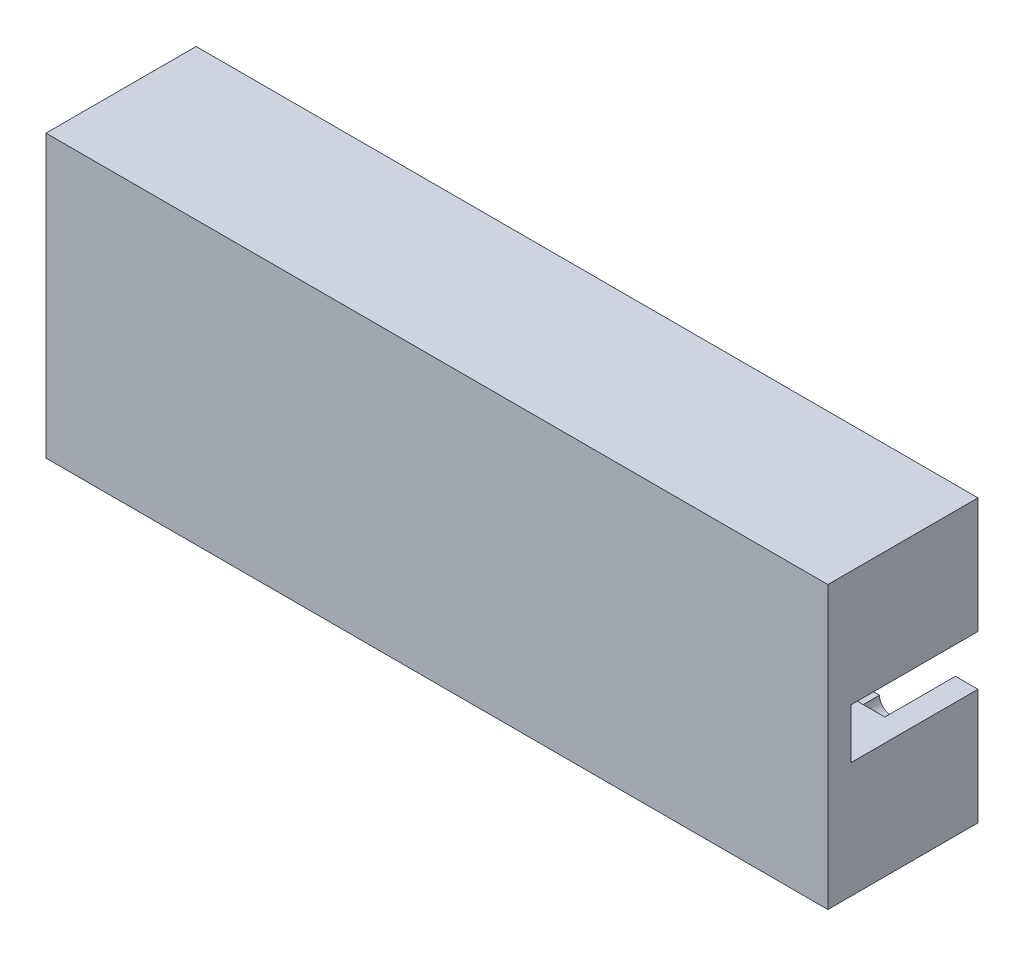
ISO-10303-21;
HEADER;
FILE_DESCRIPTION(('STEP AP214'),'2;1');
FILE_NAME('part.step','',(''),(''),'','','');
FILE_SCHEMA(('AUTOMOTIVE_DESIGN { 1 0 10303 214 1 1 1 1 }'));
ENDSEC;
DATA;
#1=APPLICATION_CONTEXT('core data for automotive mechanical design processes');
#2=APPLICATION_PROTOCOL_DEFINITION('international standard','automotive_design',2000,#1);
#3=PRODUCT_CONTEXT('',#1,'mechanical');
#4=PRODUCT('Part','Part','',(#3));
#5=PRODUCT_RELATED_PRODUCT_CATEGORY('part','',(#4));
#6=PRODUCT_DEFINITION_FORMATION('','',#4);
#7=PRODUCT_DEFINITION_CONTEXT('part definition',#1,'design');
#8=PRODUCT_DEFINITION('design','',#6,#7);
#9=PRODUCT_DEFINITION_SHAPE('','',#8);
#10=(LENGTH_UNIT() NAMED_UNIT(*) SI_UNIT(.MILLI.,.METRE.));
#11=(NAMED_UNIT(*) PLANE_ANGLE_UNIT() SI_UNIT($,.RADIAN.));
#12=(NAMED_UNIT(*) SI_UNIT($,.STERADIAN.) SOLID_ANGLE_UNIT());
#13=UNCERTAINTY_MEASURE_WITH_UNIT(LENGTH_MEASURE(1.E-05),#10,'distance_accuracy_value','');
#14=(GEOMETRIC_REPRESENTATION_CONTEXT(3) GLOBAL_UNCERTAINTY_ASSIGNED_CONTEXT((#13)) GLOBAL_UNIT_ASSIGNED_CONTEXT((#10,
#11,#12)) REPRESENTATION_CONTEXT('',''));
#15=CARTESIAN_POINT('',(0.,0.,0.));
#16=DIRECTION('',(0.,0.,1.));
#17=DIRECTION('',(1.,0.,0.));
#18=AXIS2_PLACEMENT_3D('',#15,#16,#17);
#19=CARTESIAN_POINT('',(64.135,16.1290000000001,29.591));
#20=DIRECTION('',(0.,1.,0.));
#21=DIRECTION('',(-1.,0.,0.));
#22=AXIS2_PLACEMENT_3D('',#19,#20,#21);
#23=PLANE('',#22);
#24=DIRECTION('',(-1.,0.,0.));
#25=VECTOR('',#24,1.);
#26=CARTESIAN_POINT('',(64.135,16.1290000000001,5.));
#27=LINE('',#26,#25);
#28=CARTESIAN_POINT('',(-19.9239542111493,16.1290000000002,5.));
#29=VERTEX_POINT('',#28);
#30=CARTESIAN_POINT('',(-43.5760457888507,16.1290000000002,5.));
#31=VERTEX_POINT('',#30);
#32=EDGE_CURVE('E223',#29,#31,#27,.T.);
#33=ORIENTED_EDGE('',*,*,#32,.F.);
#34=DIRECTION('',(0.,0.,-1.));
#35=VECTOR('',#34,1.);
#36=CARTESIAN_POINT('',(-19.9239542111492,16.1290000000002,5.));
#37=LINE('',#36,#35);
#38=CARTESIAN_POINT('',(-19.9239542111493,16.1290000000002,0.));
#39=VERTEX_POINT('',#38);
#40=EDGE_CURVE('E229',#29,#39,#37,.T.);
#41=ORIENTED_EDGE('',*,*,#40,.T.);
#42=DIRECTION('',(1.,0.,0.));
#43=VECTOR('',#42,1.);
#44=CARTESIAN_POINT('',(64.135,16.1290000000001,0.));
#45=LINE('',#44,#43);
#46=CARTESIAN_POINT('',(59.3725,16.1290000000001,0.));
#47=VERTEX_POINT('',#46);
#48=EDGE_CURVE('E369',#39,#47,#45,.T.);
#49=ORIENTED_EDGE('',*,*,#48,.T.);
#50=DIRECTION('',(0.,0.,-1.));
#51=VECTOR('',#50,1.);
#52=CARTESIAN_POINT('',(59.3725,16.1290000000001,66.9165787162104));
#53=LINE('',#52,#51);
#54=CARTESIAN_POINT('',(59.3725,16.1290000000001,29.591));
#55=VERTEX_POINT('',#54);
#56=EDGE_CURVE('E247',#55,#47,#53,.T.);
#57=ORIENTED_EDGE('',*,*,#56,.F.);
#58=DIRECTION('',(1.,0.,0.));
#59=VECTOR('',#58,1.);
#60=CARTESIAN_POINT('',(64.135,16.1290000000001,29.591));
#61=LINE('',#60,#59);
#62=CARTESIAN_POINT('',(-63.6905,16.1290000000001,29.591));
#63=VERTEX_POINT('',#62);
#64=EDGE_CURVE('E356',#63,#55,#61,.T.);
#65=ORIENTED_EDGE('',*,*,#64,.F.);
#66=DIRECTION('',(0.,0.,-1.));
#67=VECTOR('',#66,1.);
#68=CARTESIAN_POINT('',(-63.6905,16.1290000000001,66.9165787162104));
#69=LINE('',#68,#67);
#70=CARTESIAN_POINT('',(-63.6905,16.1290000000001,0.));
#71=VERTEX_POINT('',#70);
#72=EDGE_CURVE('E267',#63,#71,#69,.T.);
#73=ORIENTED_EDGE('',*,*,#72,.T.);
#74=CARTESIAN_POINT('',(-43.5760457888507,16.1290000000002,0.));
#75=VERTEX_POINT('',#74);
#76=EDGE_CURVE('E237',#71,#75,#45,.T.);
#77=ORIENTED_EDGE('',*,*,#76,.T.);
#78=DIRECTION('',(0.,0.,-1.));
#79=VECTOR('',#78,1.);
#80=CARTESIAN_POINT('',(-43.5760457888507,16.1290000000002,5.));
#81=LINE('',#80,#79);
#82=EDGE_CURVE('E66',#75,#31,#81,.F.);
#83=ORIENTED_EDGE('',*,*,#82,.T.);
#84=EDGE_LOOP('',(#33,#41,#49,#57,#65,#73,#77,#83));
#85=FACE_BOUND('',#84,.T.);
#86=ADVANCED_FACE('F43',(#85),#23,.F.);
#87=CARTESIAN_POINT('',(64.135,-16.1289999999999,29.591));
#88=DIRECTION('',(0.,-1.,0.));
#89=DIRECTION('',(0.,0.,-1.));
#90=AXIS2_PLACEMENT_3D('',#87,#88,#89);
#91=PLANE('',#90);
#92=DIRECTION('',(1.,0.,0.));
#93=VECTOR('',#92,1.);
#94=CARTESIAN_POINT('',(64.135,-16.1289999999999,5.));
#95=LINE('',#94,#93);
#96=CARTESIAN_POINT('',(-43.5760457888512,-16.1289999999999,5.));
#97=VERTEX_POINT('',#96);
#98=CARTESIAN_POINT('',(-19.9239542111488,-16.1289999999999,5.));
#99=VERTEX_POINT('',#98);
#100=EDGE_CURVE('E12',#97,#99,#95,.T.);
#101=ORIENTED_EDGE('',*,*,#100,.F.);
#102=DIRECTION('',(0.,0.,-1.));
#103=VECTOR('',#102,1.);
#104=CARTESIAN_POINT('',(-43.5760457888512,-16.1289999999999,5.));
#105=LINE('',#104,#103);
#106=CARTESIAN_POINT('',(-43.5760457888512,-16.1289999999999,0.));
#107=VERTEX_POINT('',#106);
#108=EDGE_CURVE('E238',#97,#107,#105,.T.);
#109=ORIENTED_EDGE('',*,*,#108,.T.);
#110=DIRECTION('',(-1.,0.,0.));
#111=VECTOR('',#110,1.);
#112=CARTESIAN_POINT('',(64.135,-16.1289999999999,0.));
#113=LINE('',#112,#111);
#114=CARTESIAN_POINT('',(-63.6905,-16.1290000000001,0.));
#115=VERTEX_POINT('',#114);
#116=EDGE_CURVE('E346',#107,#115,#113,.T.);
#117=ORIENTED_EDGE('',*,*,#116,.T.);
#118=DIRECTION('',(0.,0.,-1.));
#119=VECTOR('',#118,1.);
#120=CARTESIAN_POINT('',(-63.6905,-16.1290000000001,66.9165787162104));
#121=LINE('',#120,#119);
#122=CARTESIAN_POINT('',(-63.6905,-16.1289999999999,29.591));
#123=VERTEX_POINT('',#122);
#124=EDGE_CURVE('E270',#123,#115,#121,.T.);
#125=ORIENTED_EDGE('',*,*,#124,.F.);
#126=DIRECTION('',(-1.,0.,0.));
#127=VECTOR('',#126,1.);
#128=CARTESIAN_POINT('',(64.135,-16.1289999999999,29.591));
#129=LINE('',#128,#127);
#130=CARTESIAN_POINT('',(59.3725,-16.1290000000001,29.591));
#131=VERTEX_POINT('',#130);
#132=EDGE_CURVE('E350',#131,#123,#129,.T.);
#133=ORIENTED_EDGE('',*,*,#132,.F.);
#134=DIRECTION('',(0.,0.,-1.));
#135=VECTOR('',#134,1.);
#136=CARTESIAN_POINT('',(59.3725,-16.1290000000001,66.9165787162104));
#137=LINE('',#136,#135);
#138=CARTESIAN_POINT('',(59.3725,-16.1290000000001,0.));
#139=VERTEX_POINT('',#138);
#140=EDGE_CURVE('E253',#131,#139,#137,.T.);
#141=ORIENTED_EDGE('',*,*,#140,.T.);
#142=CARTESIAN_POINT('',(-19.9239542111488,-16.1289999999999,0.));
#143=VERTEX_POINT('',#142);
#144=EDGE_CURVE('E364',#139,#143,#113,.T.);
#145=ORIENTED_EDGE('',*,*,#144,.T.);
#146=DIRECTION('',(0.,0.,-1.));
#147=VECTOR('',#146,1.);
#148=CARTESIAN_POINT('',(-19.9239542111488,-16.1289999999999,5.));
#149=LINE('',#148,#147);
#150=EDGE_CURVE('E58',#143,#99,#149,.F.);
#151=ORIENTED_EDGE('',*,*,#150,.T.);
#152=EDGE_LOOP('',(#101,#109,#117,#125,#133,#141,#145,#151));
#153=FACE_BOUND('',#152,.T.);
#154=ADVANCED_FACE('F427',(#153),#91,.F.);
#155=CARTESIAN_POINT('',(0.,0.,14.351));
#156=DIRECTION('',(0.,0.,-1.));
#157=DIRECTION('',(-1.,0.,0.));
#158=AXIS2_PLACEMENT_3D('',#155,#156,#157);
#159=PLANE('',#158);
#160=DIRECTION('',(1.,0.,0.));
#161=VECTOR('',#160,1.);
#162=CARTESIAN_POINT('',(0.,5.07999999999999,14.351));
#163=LINE('',#162,#161);
#164=CARTESIAN_POINT('',(64.135,5.08,14.351));
#165=VERTEX_POINT('',#164);
#166=CARTESIAN_POINT('',(74.803,5.08,14.351));
#167=VERTEX_POINT('',#166);
#168=EDGE_CURVE('E308',#165,#167,#163,.T.);
#169=ORIENTED_EDGE('',*,*,#168,.F.);
#170=DIRECTION('',(0.,-1.,0.));
#171=VECTOR('',#170,1.);
#172=CARTESIAN_POINT('',(64.135,0.,14.351));
#173=LINE('',#172,#171);
#174=CARTESIAN_POINT('',(64.135,16.1290000000001,14.351));
#175=VERTEX_POINT('',#174);
#176=EDGE_CURVE('E332',#175,#165,#173,.T.);
#177=ORIENTED_EDGE('',*,*,#176,.F.);
#178=DIRECTION('',(-1.,0.,0.));
#179=VECTOR('',#178,1.);
#180=CARTESIAN_POINT('',(64.135,16.1290000000001,14.351));
#181=LINE('',#180,#179);
#182=CARTESIAN_POINT('',(72.42175,16.1290000000001,14.351));
#183=VERTEX_POINT('',#182);
#184=EDGE_CURVE('E335',#183,#175,#181,.T.);
#185=ORIENTED_EDGE('',*,*,#184,.F.);
#186=CARTESIAN_POINT('',(72.42175,13.7477500000001,14.351));
#187=DIRECTION('',(0.,0.,-1.));
#188=DIRECTION('',(-1.,0.,0.));
#189=AXIS2_PLACEMENT_3D('',#186,#187,#188);
#190=CIRCLE('',#189,2.38125);
#191=CARTESIAN_POINT('',(74.803,13.7477500000001,14.351));
#192=VERTEX_POINT('',#191);
#193=EDGE_CURVE('E406',#183,#192,#190,.T.);
#194=ORIENTED_EDGE('',*,*,#193,.T.);
#195=DIRECTION('',(0.,1.,0.));
#196=VECTOR('',#195,1.);
#197=CARTESIAN_POINT('',(74.803,16.1290000000001,14.351));
#198=LINE('',#197,#196);
#199=EDGE_CURVE('E327',#167,#192,#198,.T.);
#200=ORIENTED_EDGE('',*,*,#199,.F.);
#201=EDGE_LOOP('',(#169,#177,#185,#194,#200));
#202=FACE_BOUND('',#201,.T.);
#203=ADVANCED_FACE('F490',(#202),#159,.T.);
#204=CARTESIAN_POINT('',(79.375,-28.5749999999998,29.591));
#205=DIRECTION('',(-1.,0.,0.));
#206=DIRECTION('',(0.,0.,1.));
#207=AXIS2_PLACEMENT_3D('',#204,#205,#206);
#208=PLANE('',#207);
#209=DIRECTION('',(0.,1.,0.));
#210=VECTOR('',#209,1.);
#211=CARTESIAN_POINT('',(79.375,-5.08,25.781));
#212=LINE('',#211,#210);
#213=CARTESIAN_POINT('',(79.375,-5.08,25.781));
#214=VERTEX_POINT('',#213);
#215=CARTESIAN_POINT('',(79.375,5.08,25.781));
#216=VERTEX_POINT('',#215);
#217=EDGE_CURVE('E297',#214,#216,#212,.T.);
#218=ORIENTED_EDGE('',*,*,#217,.T.);
#219=DIRECTION('',(0.,0.,-1.));
#220=VECTOR('',#219,1.);
#221=CARTESIAN_POINT('',(79.375,5.08,29.591));
#222=LINE('',#221,#220);
#223=CARTESIAN_POINT('',(79.375,5.08,0.));
#224=VERTEX_POINT('',#223);
#225=EDGE_CURVE('E343',#216,#224,#222,.T.);
#226=ORIENTED_EDGE('',*,*,#225,.T.);
#227=DIRECTION('',(0.,1.,0.));
#228=VECTOR('',#227,1.);
#229=CARTESIAN_POINT('',(79.375,-28.5749999999998,0.));
#230=LINE('',#229,#228);
#231=CARTESIAN_POINT('',(79.375,28.5750000000002,0.));
#232=VERTEX_POINT('',#231);
#233=EDGE_CURVE('E373',#224,#232,#230,.T.);
#234=ORIENTED_EDGE('',*,*,#233,.T.);
#235=DIRECTION('',(0.,0.,-1.));
#236=VECTOR('',#235,1.);
#237=CARTESIAN_POINT('',(79.375,28.5750000000002,29.591));
#238=LINE('',#237,#236);
#239=CARTESIAN_POINT('',(79.375,28.575,30.48));
#240=VERTEX_POINT('',#239);
#241=EDGE_CURVE('E398',#240,#232,#238,.T.);
#242=ORIENTED_EDGE('',*,*,#241,.F.);
#243=DIRECTION('',(0.,1.,0.));
#244=VECTOR('',#243,1.);
#245=CARTESIAN_POINT('',(79.375,28.575,30.48));
#246=LINE('',#245,#244);
#247=CARTESIAN_POINT('',(79.375,-28.575,30.48));
#248=VERTEX_POINT('',#247);
#249=EDGE_CURVE('E284',#248,#240,#246,.T.);
#250=ORIENTED_EDGE('',*,*,#249,.F.);
#251=DIRECTION('',(0.,0.,-1.));
#252=VECTOR('',#251,1.);
#253=CARTESIAN_POINT('',(79.375,-28.5749999999998,29.591));
#254=LINE('',#253,#252);
#255=CARTESIAN_POINT('',(79.375,-28.5749999999998,0.));
#256=VERTEX_POINT('',#255);
#257=EDGE_CURVE('E389',#248,#256,#254,.T.);
#258=ORIENTED_EDGE('',*,*,#257,.T.);
#259=CARTESIAN_POINT('',(79.375,-5.08,0.));
#260=VERTEX_POINT('',#259);
#261=EDGE_CURVE('E380',#256,#260,#230,.T.);
#262=ORIENTED_EDGE('',*,*,#261,.T.);
#263=DIRECTION('',(0.,0.,-1.));
#264=VECTOR('',#263,1.);
#265=CARTESIAN_POINT('',(79.375,-5.08,29.591));
#266=LINE('',#265,#264);
#267=EDGE_CURVE('E318',#214,#260,#266,.T.);
#268=ORIENTED_EDGE('',*,*,#267,.F.);
#269=EDGE_LOOP('',(#218,#226,#234,#242,#250,#258,#262,#268));
#270=FACE_BOUND('',#269,.T.);
#271=ADVANCED_FACE('F458',(#270),#208,.F.);
#272=CARTESIAN_POINT('',(0.,0.,0.));
#273=DIRECTION('',(0.,0.,-1.));
#274=DIRECTION('',(-1.,0.,0.));
#275=AXIS2_PLACEMENT_3D('',#272,#273,#274);
#276=PLANE('',#275);
#277=CARTESIAN_POINT('',(-31.75,0.,0.));
#278=DIRECTION('',(0.,0.,-1.));
#279=DIRECTION('',(-1.,0.,0.));
#280=AXIS2_PLACEMENT_3D('',#277,#278,#279);
#281=CIRCLE('',#280,20.);
#282=EDGE_CURVE('E508',#75,#39,#281,.T.);
#283=ORIENTED_EDGE('',*,*,#282,.F.);
#284=ORIENTED_EDGE('',*,*,#76,.F.);
#285=CARTESIAN_POINT('',(-66.07175,16.1290000000001,0.));
#286=DIRECTION('',(0.,0.,-1.));
#287=DIRECTION('',(1.,0.,0.));
#288=AXIS2_PLACEMENT_3D('',#285,#286,#287);
#289=CIRCLE('',#288,2.38124999999999);
#290=CARTESIAN_POINT('',(-68.453,16.1290000000001,0.));
#291=VERTEX_POINT('',#290);
#292=EDGE_CURVE('E275',#291,#71,#289,.T.);
#293=ORIENTED_EDGE('',*,*,#292,.F.);
#294=DIRECTION('',(0.,1.,0.));
#295=VECTOR('',#294,1.);
#296=CARTESIAN_POINT('',(-68.453,-16.1289999999999,0.));
#297=LINE('',#296,#295);
#298=CARTESIAN_POINT('',(-68.453,-16.1290000000001,0.));
#299=VERTEX_POINT('',#298);
#300=EDGE_CURVE('E363',#299,#291,#297,.T.);
#301=ORIENTED_EDGE('',*,*,#300,.F.);
#302=CARTESIAN_POINT('',(-66.07175,-16.1290000000001,0.));
#303=DIRECTION('',(0.,0.,-1.));
#304=DIRECTION('',(1.,0.,0.));
#305=AXIS2_PLACEMENT_3D('',#302,#303,#304);
#306=CIRCLE('',#305,2.38124999999999);
#307=EDGE_CURVE('E250',#115,#299,#306,.T.);
#308=ORIENTED_EDGE('',*,*,#307,.F.);
#309=ORIENTED_EDGE('',*,*,#116,.F.);
#310=CARTESIAN_POINT('',(-31.75,0.,0.));
#311=DIRECTION('',(0.,0.,-1.));
#312=DIRECTION('',(-1.,0.,0.));
#313=AXIS2_PLACEMENT_3D('',#310,#311,#312);
#314=CIRCLE('',#313,20.);
#315=EDGE_CURVE('E51',#143,#107,#314,.T.);
#316=ORIENTED_EDGE('',*,*,#315,.F.);
#317=ORIENTED_EDGE('',*,*,#144,.F.);
#318=CARTESIAN_POINT('',(61.75375,-16.1290000000001,0.));
#319=DIRECTION('',(0.,0.,-1.));
#320=DIRECTION('',(-1.,0.,0.));
#321=AXIS2_PLACEMENT_3D('',#318,#319,#320);
#322=CIRCLE('',#321,2.38124999999999);
#323=CARTESIAN_POINT('',(64.135,-16.1290000000001,0.));
#324=VERTEX_POINT('',#323);
#325=EDGE_CURVE('E248',#324,#139,#322,.T.);
#326=ORIENTED_EDGE('',*,*,#325,.F.);
#327=CARTESIAN_POINT('',(72.42175,-16.1289999999999,0.));
#328=VERTEX_POINT('',#327);
#329=EDGE_CURVE('E360',#328,#324,#113,.T.);
#330=ORIENTED_EDGE('',*,*,#329,.F.);
#331=CARTESIAN_POINT('',(72.42175,-13.7477499999999,0.));
#332=DIRECTION('',(0.,0.,-1.));
#333=DIRECTION('',(-1.,0.,0.));
#334=AXIS2_PLACEMENT_3D('',#331,#332,#333);
#335=CIRCLE('',#334,2.38125);
#336=CARTESIAN_POINT('',(74.803,-13.7477499999999,0.));
#337=VERTEX_POINT('',#336);
#338=EDGE_CURVE('E415',#328,#337,#335,.F.);
#339=ORIENTED_EDGE('',*,*,#338,.T.);
#340=DIRECTION('',(0.,1.,0.));
#341=VECTOR('',#340,1.);
#342=CARTESIAN_POINT('',(74.803,-16.1290000000001,0.));
#343=LINE('',#342,#341);
#344=CARTESIAN_POINT('',(74.803,-5.08,0.));
#345=VERTEX_POINT('',#344);
#346=EDGE_CURVE('E321',#337,#345,#343,.T.);
#347=ORIENTED_EDGE('',*,*,#346,.T.);
#348=DIRECTION('',(1.,0.,0.));
#349=VECTOR('',#348,1.);
#350=CARTESIAN_POINT('',(74.803,-5.08,0.));
#351=LINE('',#350,#349);
#352=EDGE_CURVE('E310',#345,#260,#351,.T.);
#353=ORIENTED_EDGE('',*,*,#352,.T.);
#354=ORIENTED_EDGE('',*,*,#261,.F.);
#355=DIRECTION('',(1.,0.,0.));
#356=VECTOR('',#355,1.);
#357=CARTESIAN_POINT('',(-79.375,-28.5749999999998,0.));
#358=LINE('',#357,#356);
#359=CARTESIAN_POINT('',(-79.375,-28.5749999999998,0.));
#360=VERTEX_POINT('',#359);
#361=EDGE_CURVE('E387',#360,#256,#358,.T.);
#362=ORIENTED_EDGE('',*,*,#361,.F.);
#363=DIRECTION('',(0.,-1.,0.));
#364=VECTOR('',#363,1.);
#365=CARTESIAN_POINT('',(-79.375,-28.5749999999998,0.));
#366=LINE('',#365,#364);
#367=CARTESIAN_POINT('',(-79.375,28.5750000000002,0.));
#368=VERTEX_POINT('',#367);
#369=EDGE_CURVE('E385',#368,#360,#366,.T.);
#370=ORIENTED_EDGE('',*,*,#369,.F.);
#371=DIRECTION('',(-1.,0.,0.));
#372=VECTOR('',#371,1.);
#373=CARTESIAN_POINT('',(-79.375,28.5750000000002,0.));
#374=LINE('',#373,#372);
#375=EDGE_CURVE('E383',#232,#368,#374,.T.);
#376=ORIENTED_EDGE('',*,*,#375,.F.);
#377=ORIENTED_EDGE('',*,*,#233,.F.);
#378=DIRECTION('',(1.,0.,0.));
#379=VECTOR('',#378,1.);
#380=CARTESIAN_POINT('',(74.803,5.08,0.));
#381=LINE('',#380,#379);
#382=CARTESIAN_POINT('',(74.803,5.08,0.));
#383=VERTEX_POINT('',#382);
#384=EDGE_CURVE('E337',#383,#224,#381,.T.);
#385=ORIENTED_EDGE('',*,*,#384,.F.);
#386=DIRECTION('',(0.,-1.,0.));
#387=VECTOR('',#386,1.);
#388=CARTESIAN_POINT('',(74.803,16.1290000000001,0.));
#389=LINE('',#388,#387);
#390=CARTESIAN_POINT('',(74.803,13.7477500000001,0.));
#391=VERTEX_POINT('',#390);
#392=EDGE_CURVE('E326',#391,#383,#389,.T.);
#393=ORIENTED_EDGE('',*,*,#392,.F.);
#394=CARTESIAN_POINT('',(72.42175,13.7477500000001,0.));
#395=DIRECTION('',(0.,0.,-1.));
#396=DIRECTION('',(-1.,0.,0.));
#397=AXIS2_PLACEMENT_3D('',#394,#395,#396);
#398=CIRCLE('',#397,2.38125);
#399=CARTESIAN_POINT('',(72.42175,16.1290000000001,0.));
#400=VERTEX_POINT('',#399);
#401=EDGE_CURVE('E417',#391,#400,#398,.F.);
#402=ORIENTED_EDGE('',*,*,#401,.T.);
#403=CARTESIAN_POINT('',(64.135,16.1290000000001,0.));
#404=VERTEX_POINT('',#403);
#405=EDGE_CURVE('E367',#404,#400,#45,.T.);
#406=ORIENTED_EDGE('',*,*,#405,.F.);
#407=CARTESIAN_POINT('',(61.75375,16.1290000000001,0.));
#408=DIRECTION('',(0.,0.,-1.));
#409=DIRECTION('',(-1.,0.,0.));
#410=AXIS2_PLACEMENT_3D('',#407,#408,#409);
#411=CIRCLE('',#410,2.38124999999999);
#412=EDGE_CURVE('E245',#47,#404,#411,.T.);
#413=ORIENTED_EDGE('',*,*,#412,.F.);
#414=ORIENTED_EDGE('',*,*,#48,.F.);
#415=EDGE_LOOP('',(#283,#284,#293,#301,#308,#309,#316,#317,#326,#330,#339,#347,#353,#354,#362,
#370,#376,#377,#385,#393,#402,#406,#413,#414));
#416=FACE_BOUND('',#415,.T.);
#417=ADVANCED_FACE('F430',(#416),#276,.T.);
#418=CARTESIAN_POINT('',(64.135,-16.1289999999999,29.591));
#419=DIRECTION('',(1.,0.,0.));
#420=DIRECTION('',(0.,0.,-1.));
#421=AXIS2_PLACEMENT_3D('',#418,#419,#420);
#422=PLANE('',#421);
#423=ORIENTED_EDGE('',*,*,#176,.T.);
#424=DIRECTION('',(0.,0.,-1.));
#425=VECTOR('',#424,1.);
#426=CARTESIAN_POINT('',(64.135,5.08,47.9072004793571));
#427=LINE('',#426,#425);
#428=CARTESIAN_POINT('',(64.135,5.08,25.781));
#429=VERTEX_POINT('',#428);
#430=EDGE_CURVE('E295',#429,#165,#427,.T.);
#431=ORIENTED_EDGE('',*,*,#430,.F.);
#432=DIRECTION('',(0.,-1.,0.));
#433=VECTOR('',#432,1.);
#434=CARTESIAN_POINT('',(64.135,-5.08,25.781));
#435=LINE('',#434,#433);
#436=CARTESIAN_POINT('',(64.135,-5.08,25.781));
#437=VERTEX_POINT('',#436);
#438=EDGE_CURVE('E291',#429,#437,#435,.T.);
#439=ORIENTED_EDGE('',*,*,#438,.T.);
#440=DIRECTION('',(0.,0.,-1.));
#441=VECTOR('',#440,1.);
#442=CARTESIAN_POINT('',(64.135,-5.08,47.9072004793571));
#443=LINE('',#442,#441);
#444=CARTESIAN_POINT('',(64.135,-5.08,14.351));
#445=VERTEX_POINT('',#444);
#446=EDGE_CURVE('E290',#437,#445,#443,.T.);
#447=ORIENTED_EDGE('',*,*,#446,.T.);
#448=CARTESIAN_POINT('',(64.135,-16.1290000000001,14.351));
#449=VERTEX_POINT('',#448);
#450=EDGE_CURVE('E330',#445,#449,#173,.T.);
#451=ORIENTED_EDGE('',*,*,#450,.T.);
#452=DIRECTION('',(0.,0.,-1.));
#453=VECTOR('',#452,1.);
#454=CARTESIAN_POINT('',(64.135,-16.1289999999999,29.591));
#455=LINE('',#454,#453);
#456=CARTESIAN_POINT('',(64.135,-16.1289999999999,29.591));
#457=VERTEX_POINT('',#456);
#458=EDGE_CURVE('E359',#457,#449,#455,.T.);
#459=ORIENTED_EDGE('',*,*,#458,.F.);
#460=DIRECTION('',(0.,-1.,0.));
#461=VECTOR('',#460,1.);
#462=CARTESIAN_POINT('',(64.135,-16.1289999999999,29.591));
#463=LINE('',#462,#461);
#464=CARTESIAN_POINT('',(64.135,16.1290000000001,29.591));
#465=VERTEX_POINT('',#464);
#466=EDGE_CURVE('E347',#465,#457,#463,.T.);
#467=ORIENTED_EDGE('',*,*,#466,.F.);
#468=DIRECTION('',(0.,0.,-1.));
#469=VECTOR('',#468,1.);
#470=CARTESIAN_POINT('',(64.135,16.1290000000001,29.591));
#471=LINE('',#470,#469);
#472=EDGE_CURVE('E370',#465,#175,#471,.T.);
#473=ORIENTED_EDGE('',*,*,#472,.T.);
#474=EDGE_LOOP('',(#423,#431,#439,#447,#451,#459,#467,#473));
#475=FACE_BOUND('',#474,.T.);
#476=ADVANCED_FACE('F485',(#475),#422,.F.);
#477=CARTESIAN_POINT('',(-79.375,28.5750000000002,29.591));
#478=DIRECTION('',(0.,-1.,0.));
#479=DIRECTION('',(0.,0.,-1.));
#480=AXIS2_PLACEMENT_3D('',#477,#478,#479);
#481=PLANE('',#480);
#482=ORIENTED_EDGE('',*,*,#375,.T.);
#483=DIRECTION('',(0.,0.,-1.));
#484=VECTOR('',#483,1.);
#485=CARTESIAN_POINT('',(-79.375,28.5750000000002,29.591));
#486=LINE('',#485,#484);
#487=CARTESIAN_POINT('',(-79.375,28.575,30.48));
#488=VERTEX_POINT('',#487);
#489=EDGE_CURVE('E395',#488,#368,#486,.T.);
#490=ORIENTED_EDGE('',*,*,#489,.F.);
#491=DIRECTION('',(-1.,0.,0.));
#492=VECTOR('',#491,1.);
#493=CARTESIAN_POINT('',(-79.375,28.575,30.48));
#494=LINE('',#493,#492);
#495=EDGE_CURVE('E287',#240,#488,#494,.T.);
#496=ORIENTED_EDGE('',*,*,#495,.F.);
#497=ORIENTED_EDGE('',*,*,#241,.T.);
#498=EDGE_LOOP('',(#482,#490,#496,#497));
#499=FACE_BOUND('',#498,.T.);
#500=ADVANCED_FACE('F474',(#499),#481,.F.);
#501=CARTESIAN_POINT('',(-79.375,-28.5749999999998,29.591));
#502=DIRECTION('',(1.,0.,0.));
#503=DIRECTION('',(0.,0.,-1.));
#504=AXIS2_PLACEMENT_3D('',#501,#502,#503);
#505=PLANE('',#504);
#506=ORIENTED_EDGE('',*,*,#369,.T.);
#507=DIRECTION('',(0.,0.,-1.));
#508=VECTOR('',#507,1.);
#509=CARTESIAN_POINT('',(-79.375,-28.5749999999998,29.591));
#510=LINE('',#509,#508);
#511=CARTESIAN_POINT('',(-79.375,-28.575,30.48));
#512=VERTEX_POINT('',#511);
#513=EDGE_CURVE('E392',#512,#360,#510,.T.);
#514=ORIENTED_EDGE('',*,*,#513,.F.);
#515=DIRECTION('',(0.,-1.,0.));
#516=VECTOR('',#515,1.);
#517=CARTESIAN_POINT('',(-79.375,28.575,30.48));
#518=LINE('',#517,#516);
#519=EDGE_CURVE('E266',#488,#512,#518,.T.);
#520=ORIENTED_EDGE('',*,*,#519,.F.);
#521=ORIENTED_EDGE('',*,*,#489,.T.);
#522=EDGE_LOOP('',(#506,#514,#520,#521));
#523=FACE_BOUND('',#522,.T.);
#524=ADVANCED_FACE('F468',(#523),#505,.F.);
#525=CARTESIAN_POINT('',(-79.375,-28.5749999999998,29.591));
#526=DIRECTION('',(0.,1.,0.));
#527=DIRECTION('',(0.,0.,1.));
#528=AXIS2_PLACEMENT_3D('',#525,#526,#527);
#529=PLANE('',#528);
#530=ORIENTED_EDGE('',*,*,#361,.T.);
#531=ORIENTED_EDGE('',*,*,#257,.F.);
#532=DIRECTION('',(1.,0.,0.));
#533=VECTOR('',#532,1.);
#534=CARTESIAN_POINT('',(-79.375,-28.575,30.48));
#535=LINE('',#534,#533);
#536=EDGE_CURVE('E281',#512,#248,#535,.T.);
#537=ORIENTED_EDGE('',*,*,#536,.F.);
#538=ORIENTED_EDGE('',*,*,#513,.T.);
#539=EDGE_LOOP('',(#530,#531,#537,#538));
#540=FACE_BOUND('',#539,.T.);
#541=ADVANCED_FACE('F462',(#540),#529,.F.);
#542=ORIENTED_EDGE('',*,*,#184,.T.);
#543=DIRECTION('',(0.,0.,-1.));
#544=VECTOR('',#543,1.);
#545=CARTESIAN_POINT('',(64.135,16.1290000000001,66.9165787162104));
#546=LINE('',#545,#544);
#547=EDGE_CURVE('E258',#175,#404,#546,.T.);
#548=ORIENTED_EDGE('',*,*,#547,.T.);
#549=ORIENTED_EDGE('',*,*,#405,.T.);
#550=DIRECTION('',(0.,0.,-1.));
#551=VECTOR('',#550,1.);
#552=CARTESIAN_POINT('',(72.42175,16.1290000000001,14.351));
#553=LINE('',#552,#551);
#554=EDGE_CURVE('E413',#400,#183,#553,.F.);
#555=ORIENTED_EDGE('',*,*,#554,.T.);
#556=EDGE_LOOP('',(#542,#548,#549,#555));
#557=FACE_BOUND('',#556,.T.);
#558=ADVANCED_FACE('F503',(#557),#23,.F.);
#559=CARTESIAN_POINT('',(-68.453,-16.1289999999999,29.591));
#560=DIRECTION('',(-1.,0.,0.));
#561=DIRECTION('',(0.,-1.,0.));
#562=AXIS2_PLACEMENT_3D('',#559,#560,#561);
#563=PLANE('',#562);
#564=ORIENTED_EDGE('',*,*,#300,.T.);
#565=DIRECTION('',(0.,0.,-1.));
#566=VECTOR('',#565,1.);
#567=CARTESIAN_POINT('',(-68.453,16.1290000000002,29.591));
#568=LINE('',#567,#566);
#569=CARTESIAN_POINT('',(-68.453,16.1290000000002,29.591));
#570=VERTEX_POINT('',#569);
#571=EDGE_CURVE('E374',#570,#291,#568,.T.);
#572=ORIENTED_EDGE('',*,*,#571,.F.);
#573=DIRECTION('',(0.,1.,0.));
#574=VECTOR('',#573,1.);
#575=CARTESIAN_POINT('',(-68.453,-16.1289999999999,29.591));
#576=LINE('',#575,#574);
#577=CARTESIAN_POINT('',(-68.453,-16.1290000000001,29.591));
#578=VERTEX_POINT('',#577);
#579=EDGE_CURVE('E353',#578,#570,#576,.T.);
#580=ORIENTED_EDGE('',*,*,#579,.F.);
#581=DIRECTION('',(0.,0.,-1.));
#582=VECTOR('',#581,1.);
#583=CARTESIAN_POINT('',(-68.453,-16.1289999999999,29.591));
#584=LINE('',#583,#582);
#585=EDGE_CURVE('E376',#578,#299,#584,.T.);
#586=ORIENTED_EDGE('',*,*,#585,.T.);
#587=EDGE_LOOP('',(#564,#572,#580,#586));
#588=FACE_BOUND('',#587,.T.);
#589=ADVANCED_FACE('F519',(#588),#563,.F.);
#590=ORIENTED_EDGE('',*,*,#329,.T.);
#591=DIRECTION('',(0.,0.,-1.));
#592=VECTOR('',#591,1.);
#593=CARTESIAN_POINT('',(64.135,-16.1290000000001,66.9165787162104));
#594=LINE('',#593,#592);
#595=EDGE_CURVE('E254',#449,#324,#594,.T.);
#596=ORIENTED_EDGE('',*,*,#595,.F.);
#597=DIRECTION('',(-1.,0.,0.));
#598=VECTOR('',#597,1.);
#599=CARTESIAN_POINT('',(64.135,-16.1290000000001,14.351));
#600=LINE('',#599,#598);
#601=CARTESIAN_POINT('',(72.42175,-16.1290000000001,14.351));
#602=VERTEX_POINT('',#601);
#603=EDGE_CURVE('E314',#602,#449,#600,.T.);
#604=ORIENTED_EDGE('',*,*,#603,.F.);
#605=DIRECTION('',(0.,0.,-1.));
#606=VECTOR('',#605,1.);
#607=CARTESIAN_POINT('',(72.42175,-16.1289999999999,29.591));
#608=LINE('',#607,#606);
#609=EDGE_CURVE('E401',#602,#328,#608,.T.);
#610=ORIENTED_EDGE('',*,*,#609,.T.);
#611=EDGE_LOOP('',(#590,#596,#604,#610));
#612=FACE_BOUND('',#611,.T.);
#613=ADVANCED_FACE('F439',(#612),#91,.F.);
#614=CARTESIAN_POINT('',(74.803,5.08,59.6792807916971));
#615=DIRECTION('',(0.,1.,0.));
#616=DIRECTION('',(-1.,0.,0.));
#617=AXIS2_PLACEMENT_3D('',#614,#615,#616);
#618=PLANE('',#617);
#619=ORIENTED_EDGE('',*,*,#225,.F.);
#620=DIRECTION('',(-1.,0.,0.));
#621=VECTOR('',#620,1.);
#622=CARTESIAN_POINT('',(79.375,5.08,25.781));
#623=LINE('',#622,#621);
#624=EDGE_CURVE('E294',#216,#429,#623,.T.);
#625=ORIENTED_EDGE('',*,*,#624,.T.);
#626=ORIENTED_EDGE('',*,*,#430,.T.);
#627=ORIENTED_EDGE('',*,*,#168,.T.);
#628=DIRECTION('',(0.,0.,-1.));
#629=VECTOR('',#628,1.);
#630=CARTESIAN_POINT('',(74.803,5.08,59.6792807916971));
#631=LINE('',#630,#629);
#632=EDGE_CURVE('E331',#167,#383,#631,.T.);
#633=ORIENTED_EDGE('',*,*,#632,.T.);
#634=ORIENTED_EDGE('',*,*,#384,.T.);
#635=EDGE_LOOP('',(#619,#625,#626,#627,#633,#634));
#636=FACE_BOUND('',#635,.T.);
#637=ADVANCED_FACE('F478',(#636),#618,.F.);
#638=DIRECTION('',(-1.,0.,0.));
#639=VECTOR('',#638,1.);
#640=CARTESIAN_POINT('',(0.,-5.08,14.351));
#641=LINE('',#640,#639);
#642=CARTESIAN_POINT('',(74.803,-5.08,14.351));
#643=VERTEX_POINT('',#642);
#644=EDGE_CURVE('E306',#643,#445,#641,.T.);
#645=ORIENTED_EDGE('',*,*,#644,.F.);
#646=DIRECTION('',(0.,-1.,0.));
#647=VECTOR('',#646,1.);
#648=CARTESIAN_POINT('',(74.803,-16.1290000000001,14.351));
#649=LINE('',#648,#647);
#650=CARTESIAN_POINT('',(74.803,-13.7477499999999,14.351));
#651=VERTEX_POINT('',#650);
#652=EDGE_CURVE('E311',#643,#651,#649,.T.);
#653=ORIENTED_EDGE('',*,*,#652,.T.);
#654=CARTESIAN_POINT('',(72.42175,-13.7477499999999,14.351));
#655=DIRECTION('',(0.,0.,-1.));
#656=DIRECTION('',(-1.,0.,0.));
#657=AXIS2_PLACEMENT_3D('',#654,#655,#656);
#658=CIRCLE('',#657,2.38125);
#659=EDGE_CURVE('E408',#651,#602,#658,.T.);
#660=ORIENTED_EDGE('',*,*,#659,.T.);
#661=ORIENTED_EDGE('',*,*,#603,.T.);
#662=ORIENTED_EDGE('',*,*,#450,.F.);
#663=EDGE_LOOP('',(#645,#653,#660,#661,#662));
#664=FACE_BOUND('',#663,.T.);
#665=ADVANCED_FACE('F576',(#664),#159,.T.);
#666=CARTESIAN_POINT('',(74.803,16.1290000000001,59.6792807916971));
#667=DIRECTION('',(1.,0.,0.));
#668=DIRECTION('',(0.,0.,-1.));
#669=AXIS2_PLACEMENT_3D('',#666,#667,#668);
#670=PLANE('',#669);
#671=ORIENTED_EDGE('',*,*,#199,.T.);
#672=DIRECTION('',(0.,0.,-1.));
#673=VECTOR('',#672,1.);
#674=CARTESIAN_POINT('',(74.803,13.7477500000001,0.));
#675=LINE('',#674,#673);
#676=EDGE_CURVE('E410',#192,#391,#675,.T.);
#677=ORIENTED_EDGE('',*,*,#676,.T.);
#678=ORIENTED_EDGE('',*,*,#392,.T.);
#679=ORIENTED_EDGE('',*,*,#632,.F.);
#680=EDGE_LOOP('',(#671,#677,#678,#679));
#681=FACE_BOUND('',#680,.T.);
#682=ADVANCED_FACE('F496',(#681),#670,.F.);
#683=CARTESIAN_POINT('',(74.803,-5.08,59.6792807916971));
#684=DIRECTION('',(0.,1.,0.));
#685=DIRECTION('',(-1.,0.,0.));
#686=AXIS2_PLACEMENT_3D('',#683,#684,#685);
#687=PLANE('',#686);
#688=ORIENTED_EDGE('',*,*,#267,.T.);
#689=ORIENTED_EDGE('',*,*,#352,.F.);
#690=DIRECTION('',(0.,0.,-1.));
#691=VECTOR('',#690,1.);
#692=CARTESIAN_POINT('',(74.803,-5.08,59.6792807916971));
#693=LINE('',#692,#691);
#694=EDGE_CURVE('E315',#643,#345,#693,.T.);
#695=ORIENTED_EDGE('',*,*,#694,.F.);
#696=ORIENTED_EDGE('',*,*,#644,.T.);
#697=ORIENTED_EDGE('',*,*,#446,.F.);
#698=DIRECTION('',(1.,0.,0.));
#699=VECTOR('',#698,1.);
#700=CARTESIAN_POINT('',(79.375,-5.08,25.781));
#701=LINE('',#700,#699);
#702=EDGE_CURVE('E300',#437,#214,#701,.T.);
#703=ORIENTED_EDGE('',*,*,#702,.T.);
#704=EDGE_LOOP('',(#688,#689,#695,#696,#697,#703));
#705=FACE_BOUND('',#704,.T.);
#706=ADVANCED_FACE('F454',(#705),#687,.T.);
#707=CARTESIAN_POINT('',(74.803,-16.1290000000001,59.6792807916971));
#708=DIRECTION('',(-1.,0.,0.));
#709=DIRECTION('',(0.,0.,1.));
#710=AXIS2_PLACEMENT_3D('',#707,#708,#709);
#711=PLANE('',#710);
#712=ORIENTED_EDGE('',*,*,#346,.F.);
#713=DIRECTION('',(0.,0.,-1.));
#714=VECTOR('',#713,1.);
#715=CARTESIAN_POINT('',(74.803,-13.7477499999999,59.6792807916971));
#716=LINE('',#715,#714);
#717=EDGE_CURVE('E404',#337,#651,#716,.F.);
#718=ORIENTED_EDGE('',*,*,#717,.T.);
#719=ORIENTED_EDGE('',*,*,#652,.F.);
#720=ORIENTED_EDGE('',*,*,#694,.T.);
#721=EDGE_LOOP('',(#712,#718,#719,#720));
#722=FACE_BOUND('',#721,.T.);
#723=ADVANCED_FACE('F449',(#722),#711,.T.);
#724=CARTESIAN_POINT('',(72.42175,-13.7477499999999,29.591));
#725=DIRECTION('',(0.,0.,-1.));
#726=DIRECTION('',(-1.,0.,0.));
#727=AXIS2_PLACEMENT_3D('',#724,#725,#726);
#728=CYLINDRICAL_SURFACE('',#727,2.38125);
#729=ORIENTED_EDGE('',*,*,#659,.F.);
#730=ORIENTED_EDGE('',*,*,#717,.F.);
#731=ORIENTED_EDGE('',*,*,#338,.F.);
#732=ORIENTED_EDGE('',*,*,#609,.F.);
#733=EDGE_LOOP('',(#729,#730,#731,#732));
#734=FACE_BOUND('',#733,.T.);
#735=ADVANCED_FACE('F445',(#734),#728,.F.);
#736=CARTESIAN_POINT('',(72.42175,13.7477500000001,59.6792807916971));
#737=DIRECTION('',(0.,0.,1.));
#738=DIRECTION('',(1.,0.,0.));
#739=AXIS2_PLACEMENT_3D('',#736,#737,#738);
#740=CYLINDRICAL_SURFACE('',#739,2.38125);
#741=ORIENTED_EDGE('',*,*,#193,.F.);
#742=ORIENTED_EDGE('',*,*,#554,.F.);
#743=ORIENTED_EDGE('',*,*,#401,.F.);
#744=ORIENTED_EDGE('',*,*,#676,.F.);
#745=EDGE_LOOP('',(#741,#742,#743,#744));
#746=FACE_BOUND('',#745,.T.);
#747=ADVANCED_FACE('F45',(#746),#740,.F.);
#748=CARTESIAN_POINT('',(0.,0.,25.781));
#749=DIRECTION('',(0.,0.,-1.));
#750=DIRECTION('',(-1.,0.,0.));
#751=AXIS2_PLACEMENT_3D('',#748,#749,#750);
#752=PLANE('',#751);
#753=ORIENTED_EDGE('',*,*,#217,.F.);
#754=ORIENTED_EDGE('',*,*,#702,.F.);
#755=ORIENTED_EDGE('',*,*,#438,.F.);
#756=ORIENTED_EDGE('',*,*,#624,.F.);
#757=EDGE_LOOP('',(#753,#754,#755,#756));
#758=FACE_BOUND('',#757,.T.);
#759=ADVANCED_FACE('F481',(#758),#752,.T.);
#760=CARTESIAN_POINT('',(0.,0.,29.591));
#761=DIRECTION('',(0.,0.,1.));
#762=DIRECTION('',(1.,0.,0.));
#763=AXIS2_PLACEMENT_3D('',#760,#761,#762);
#764=PLANE('',#763);
#765=ORIENTED_EDGE('',*,*,#64,.T.);
#766=CARTESIAN_POINT('',(61.75375,16.1290000000001,29.591));
#767=DIRECTION('',(0.,0.,1.));
#768=DIRECTION('',(1.,0.,0.));
#769=AXIS2_PLACEMENT_3D('',#766,#767,#768);
#770=CIRCLE('',#769,2.38124999999999);
#771=EDGE_CURVE('E255',#55,#465,#770,.F.);
#772=ORIENTED_EDGE('',*,*,#771,.T.);
#773=ORIENTED_EDGE('',*,*,#466,.T.);
#774=CARTESIAN_POINT('',(61.75375,-16.1290000000001,29.591));
#775=DIRECTION('',(0.,0.,1.));
#776=DIRECTION('',(1.,0.,0.));
#777=AXIS2_PLACEMENT_3D('',#774,#775,#776);
#778=CIRCLE('',#777,2.38124999999999);
#779=EDGE_CURVE('E251',#457,#131,#778,.F.);
#780=ORIENTED_EDGE('',*,*,#779,.T.);
#781=ORIENTED_EDGE('',*,*,#132,.T.);
#782=CARTESIAN_POINT('',(-66.07175,-16.1290000000001,29.591));
#783=DIRECTION('',(0.,0.,1.));
#784=DIRECTION('',(1.,0.,0.));
#785=AXIS2_PLACEMENT_3D('',#782,#783,#784);
#786=CIRCLE('',#785,2.38124999999999);
#787=EDGE_CURVE('E228',#123,#578,#786,.F.);
#788=ORIENTED_EDGE('',*,*,#787,.T.);
#789=ORIENTED_EDGE('',*,*,#579,.T.);
#790=CARTESIAN_POINT('',(-66.07175,16.1290000000001,29.591));
#791=DIRECTION('',(0.,0.,1.));
#792=DIRECTION('',(1.,0.,0.));
#793=AXIS2_PLACEMENT_3D('',#790,#791,#792);
#794=CIRCLE('',#793,2.38124999999999);
#795=EDGE_CURVE('E269',#570,#63,#794,.F.);
#796=ORIENTED_EDGE('',*,*,#795,.T.);
#797=EDGE_LOOP('',(#765,#772,#773,#780,#781,#788,#789,#796));
#798=FACE_BOUND('',#797,.T.);
#799=ADVANCED_FACE('F511',(#798),#764,.F.);
#800=CARTESIAN_POINT('',(0.,0.,30.48));
#801=DIRECTION('',(0.,0.,1.));
#802=DIRECTION('',(1.,0.,0.));
#803=AXIS2_PLACEMENT_3D('',#800,#801,#802);
#804=PLANE('',#803);
#805=ORIENTED_EDGE('',*,*,#519,.T.);
#806=ORIENTED_EDGE('',*,*,#536,.T.);
#807=ORIENTED_EDGE('',*,*,#249,.T.);
#808=ORIENTED_EDGE('',*,*,#495,.T.);
#809=EDGE_LOOP('',(#805,#806,#807,#808));
#810=FACE_BOUND('',#809,.T.);
#811=ADVANCED_FACE('F464',(#810),#804,.T.);
#812=CARTESIAN_POINT('',(-66.07175,-16.1290000000001,66.9165787162104));
#813=DIRECTION('',(0.,0.,-1.));
#814=DIRECTION('',(-1.,0.,0.));
#815=AXIS2_PLACEMENT_3D('',#812,#813,#814);
#816=CYLINDRICAL_SURFACE('',#815,2.38124999999999);
#817=ORIENTED_EDGE('',*,*,#124,.T.);
#818=ORIENTED_EDGE('',*,*,#307,.T.);
#819=ORIENTED_EDGE('',*,*,#585,.F.);
#820=ORIENTED_EDGE('',*,*,#787,.F.);
#821=EDGE_LOOP('',(#817,#818,#819,#820));
#822=FACE_BOUND('',#821,.T.);
#823=ADVANCED_FACE('F522',(#822),#816,.F.);
#824=CARTESIAN_POINT('',(61.75375,-16.1290000000001,66.9165787162104));
#825=DIRECTION('',(0.,0.,-1.));
#826=DIRECTION('',(-1.,0.,0.));
#827=AXIS2_PLACEMENT_3D('',#824,#825,#826);
#828=CYLINDRICAL_SURFACE('',#827,2.38124999999999);
#829=ORIENTED_EDGE('',*,*,#458,.T.);
#830=ORIENTED_EDGE('',*,*,#595,.T.);
#831=ORIENTED_EDGE('',*,*,#325,.T.);
#832=ORIENTED_EDGE('',*,*,#140,.F.);
#833=ORIENTED_EDGE('',*,*,#779,.F.);
#834=EDGE_LOOP('',(#829,#830,#831,#832,#833));
#835=FACE_BOUND('',#834,.T.);
#836=ADVANCED_FACE('F524',(#835),#828,.F.);
#837=CARTESIAN_POINT('',(-66.07175,16.1290000000001,66.9165787162104));
#838=DIRECTION('',(0.,0.,-1.));
#839=DIRECTION('',(-1.,0.,0.));
#840=AXIS2_PLACEMENT_3D('',#837,#838,#839);
#841=CYLINDRICAL_SURFACE('',#840,2.38124999999999);
#842=ORIENTED_EDGE('',*,*,#571,.T.);
#843=ORIENTED_EDGE('',*,*,#292,.T.);
#844=ORIENTED_EDGE('',*,*,#72,.F.);
#845=ORIENTED_EDGE('',*,*,#795,.F.);
#846=EDGE_LOOP('',(#842,#843,#844,#845));
#847=FACE_BOUND('',#846,.T.);
#848=ADVANCED_FACE('F516',(#847),#841,.F.);
#849=CARTESIAN_POINT('',(61.75375,16.1290000000001,66.9165787162104));
#850=DIRECTION('',(0.,0.,-1.));
#851=DIRECTION('',(-1.,0.,0.));
#852=AXIS2_PLACEMENT_3D('',#849,#850,#851);
#853=CYLINDRICAL_SURFACE('',#852,2.38124999999999);
#854=ORIENTED_EDGE('',*,*,#56,.T.);
#855=ORIENTED_EDGE('',*,*,#412,.T.);
#856=ORIENTED_EDGE('',*,*,#547,.F.);
#857=ORIENTED_EDGE('',*,*,#472,.F.);
#858=ORIENTED_EDGE('',*,*,#771,.F.);
#859=EDGE_LOOP('',(#854,#855,#856,#857,#858));
#860=FACE_BOUND('',#859,.T.);
#861=ADVANCED_FACE('F505',(#860),#853,.F.);
#862=CARTESIAN_POINT('',(-31.75,0.,5.));
#863=DIRECTION('',(0.,0.,-1.));
#864=DIRECTION('',(-1.,0.,0.));
#865=AXIS2_PLACEMENT_3D('',#862,#863,#864);
#866=CYLINDRICAL_SURFACE('',#865,20.);
#867=CARTESIAN_POINT('',(-31.75,0.,5.));
#868=DIRECTION('',(0.,0.,-1.));
#869=DIRECTION('',(-1.,0.,0.));
#870=AXIS2_PLACEMENT_3D('',#867,#868,#869);
#871=CIRCLE('',#870,20.);
#872=EDGE_CURVE('E232',#99,#97,#871,.T.);
#873=ORIENTED_EDGE('',*,*,#872,.F.);
#874=ORIENTED_EDGE('',*,*,#150,.F.);
#875=ORIENTED_EDGE('',*,*,#315,.T.);
#876=ORIENTED_EDGE('',*,*,#108,.F.);
#877=EDGE_LOOP('',(#873,#874,#875,#876));
#878=FACE_BOUND('',#877,.T.);
#879=ADVANCED_FACE('F419',(#878),#866,.F.);
#880=CARTESIAN_POINT('',(-31.75,0.,5.));
#881=DIRECTION('',(0.,0.,-1.));
#882=DIRECTION('',(-1.,0.,0.));
#883=AXIS2_PLACEMENT_3D('',#880,#881,#882);
#884=PLANE('',#883);
#885=ORIENTED_EDGE('',*,*,#100,.T.);
#886=ORIENTED_EDGE('',*,*,#872,.T.);
#887=EDGE_LOOP('',(#885,#886));
#888=FACE_BOUND('',#887,.T.);
#889=ADVANCED_FACE('F698',(#888),#884,.T.);
#890=ORIENTED_EDGE('',*,*,#32,.T.);
#891=EDGE_CURVE('E225',#31,#29,#871,.T.);
#892=ORIENTED_EDGE('',*,*,#891,.T.);
#893=EDGE_LOOP('',(#890,#892));
#894=FACE_BOUND('',#893,.T.);
#895=ADVANCED_FACE('F224',(#894),#884,.T.);
#896=ORIENTED_EDGE('',*,*,#891,.F.);
#897=ORIENTED_EDGE('',*,*,#82,.F.);
#898=ORIENTED_EDGE('',*,*,#282,.T.);
#899=ORIENTED_EDGE('',*,*,#40,.F.);
#900=EDGE_LOOP('',(#896,#897,#898,#899));
#901=FACE_BOUND('',#900,.T.);
#902=ADVANCED_FACE('F231',(#901),#866,.F.);
#903=CLOSED_SHELL('',(#86,#154,#203,#271,#417,#476,#500,#524,#541,#558,#589,#613,#637,#665,#682,
#706,#723,#735,#747,#759,#799,#811,#823,#836,#848,#861,#879,#889,#895,#902));
#904=MANIFOLD_SOLID_BREP('B2',#903);
#905=ADVANCED_BREP_SHAPE_REPRESENTATION('',(#18,#904),#14);
#906=SHAPE_DEFINITION_REPRESENTATION(#9,#905);
ENDSEC;
END-ISO-10303-21;
